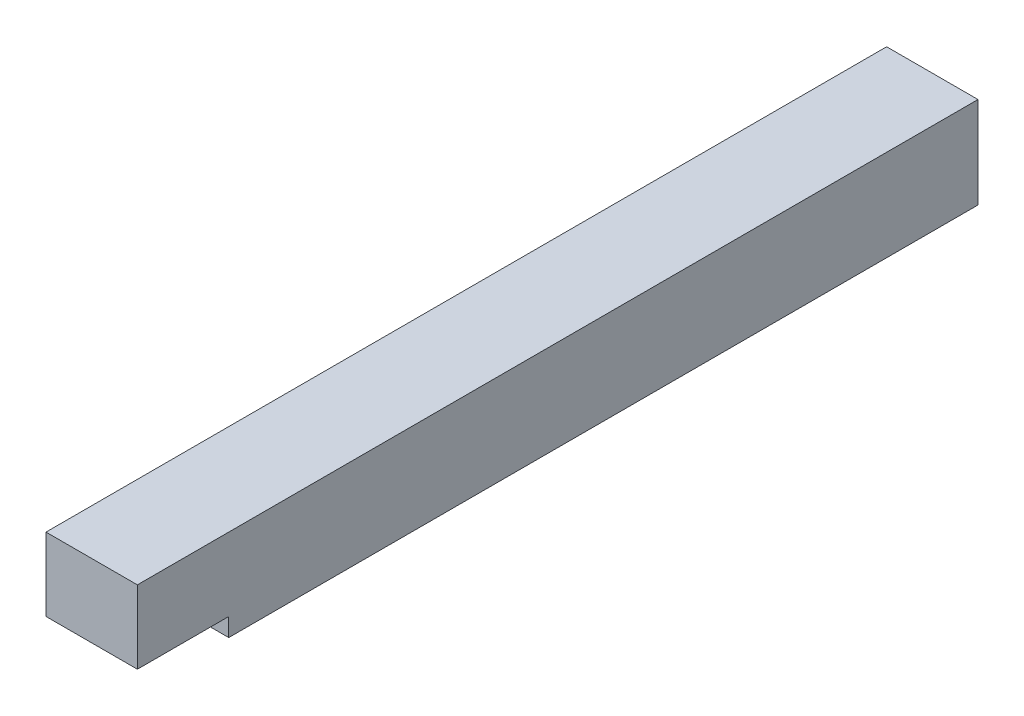
ISO-10303-21;
HEADER;
FILE_DESCRIPTION(('STEP AP214'),'2;1');
FILE_NAME('part.step','',(''),(''),'','','');
FILE_SCHEMA(('AUTOMOTIVE_DESIGN { 1 0 10303 214 1 1 1 1 }'));
ENDSEC;
DATA;
#1=APPLICATION_CONTEXT('core data for automotive mechanical design processes');
#2=APPLICATION_PROTOCOL_DEFINITION('international standard','automotive_design',2000,#1);
#3=PRODUCT_CONTEXT('',#1,'mechanical');
#4=PRODUCT('Part','Part','',(#3));
#5=PRODUCT_RELATED_PRODUCT_CATEGORY('part','',(#4));
#6=PRODUCT_DEFINITION_FORMATION('','',#4);
#7=PRODUCT_DEFINITION_CONTEXT('part definition',#1,'design');
#8=PRODUCT_DEFINITION('design','',#6,#7);
#9=PRODUCT_DEFINITION_SHAPE('','',#8);
#10=(LENGTH_UNIT() NAMED_UNIT(*) SI_UNIT(.MILLI.,.METRE.));
#11=(NAMED_UNIT(*) PLANE_ANGLE_UNIT() SI_UNIT($,.RADIAN.));
#12=(NAMED_UNIT(*) SI_UNIT($,.STERADIAN.) SOLID_ANGLE_UNIT());
#13=UNCERTAINTY_MEASURE_WITH_UNIT(LENGTH_MEASURE(1.E-05),#10,'distance_accuracy_value','');
#14=(GEOMETRIC_REPRESENTATION_CONTEXT(3) GLOBAL_UNCERTAINTY_ASSIGNED_CONTEXT((#13)) GLOBAL_UNIT_ASSIGNED_CONTEXT((#10,
#11,#12)) REPRESENTATION_CONTEXT('',''));
#15=CARTESIAN_POINT('',(0.,0.,0.));
#16=DIRECTION('',(0.,0.,1.));
#17=DIRECTION('',(1.,0.,0.));
#18=AXIS2_PLACEMENT_3D('',#15,#16,#17);
#19=CARTESIAN_POINT('',(0.,0.,92.));
#20=DIRECTION('',(1.,0.,0.));
#21=DIRECTION('',(0.,0.,-1.));
#22=AXIS2_PLACEMENT_3D('',#19,#20,#21);
#23=PLANE('',#22);
#24=DIRECTION('',(0.,0.,-1.));
#25=VECTOR('',#24,1.);
#26=CARTESIAN_POINT('',(0.,0.,92.));
#27=LINE('',#26,#25);
#28=CARTESIAN_POINT('',(0.,0.,82.));
#29=VERTEX_POINT('',#28);
#30=CARTESIAN_POINT('',(0.,0.,0.));
#31=VERTEX_POINT('',#30);
#32=EDGE_CURVE('E11',#29,#31,#27,.T.);
#33=ORIENTED_EDGE('',*,*,#32,.F.);
#34=DIRECTION('',(0.,-1.,0.));
#35=VECTOR('',#34,1.);
#36=CARTESIAN_POINT('',(0.,2.,82.));
#37=LINE('',#36,#35);
#38=CARTESIAN_POINT('',(0.,2.,82.));
#39=VERTEX_POINT('',#38);
#40=EDGE_CURVE('E101',#39,#29,#37,.T.);
#41=ORIENTED_EDGE('',*,*,#40,.F.);
#42=DIRECTION('',(0.,0.,-1.));
#43=VECTOR('',#42,1.);
#44=CARTESIAN_POINT('',(0.,2.,92.));
#45=LINE('',#44,#43);
#46=CARTESIAN_POINT('',(0.,2.,92.));
#47=VERTEX_POINT('',#46);
#48=EDGE_CURVE('E131',#47,#39,#45,.T.);
#49=ORIENTED_EDGE('',*,*,#48,.F.);
#50=DIRECTION('',(0.,-1.,0.));
#51=VECTOR('',#50,1.);
#52=CARTESIAN_POINT('',(0.,0.,92.));
#53=LINE('',#52,#51);
#54=CARTESIAN_POINT('',(0.,10.,92.));
#55=VERTEX_POINT('',#54);
#56=EDGE_CURVE('E84',#55,#47,#53,.T.);
#57=ORIENTED_EDGE('',*,*,#56,.F.);
#58=DIRECTION('',(0.,0.,-1.));
#59=VECTOR('',#58,1.);
#60=CARTESIAN_POINT('',(0.,10.,92.));
#61=LINE('',#60,#59);
#62=CARTESIAN_POINT('',(0.,10.,0.));
#63=VERTEX_POINT('',#62);
#64=EDGE_CURVE('E77',#55,#63,#61,.T.);
#65=ORIENTED_EDGE('',*,*,#64,.T.);
#66=DIRECTION('',(0.,-1.,0.));
#67=VECTOR('',#66,1.);
#68=CARTESIAN_POINT('',(0.,0.,0.));
#69=LINE('',#68,#67);
#70=EDGE_CURVE('E90',#63,#31,#69,.T.);
#71=ORIENTED_EDGE('',*,*,#70,.T.);
#72=EDGE_LOOP('',(#33,#41,#49,#57,#65,#71));
#73=FACE_BOUND('',#72,.T.);
#74=ADVANCED_FACE('F33',(#73),#23,.F.);
#75=CARTESIAN_POINT('',(0.,0.,92.));
#76=DIRECTION('',(0.,1.,0.));
#77=DIRECTION('',(0.,0.,1.));
#78=AXIS2_PLACEMENT_3D('',#75,#76,#77);
#79=PLANE('',#78);
#80=DIRECTION('',(0.,0.,-1.));
#81=VECTOR('',#80,1.);
#82=CARTESIAN_POINT('',(10.,0.,92.));
#83=LINE('',#82,#81);
#84=CARTESIAN_POINT('',(10.,0.,82.));
#85=VERTEX_POINT('',#84);
#86=CARTESIAN_POINT('',(10.,0.,0.));
#87=VERTEX_POINT('',#86);
#88=EDGE_CURVE('E40',#85,#87,#83,.T.);
#89=ORIENTED_EDGE('',*,*,#88,.F.);
#90=DIRECTION('',(1.,0.,0.));
#91=VECTOR('',#90,1.);
#92=CARTESIAN_POINT('',(10.,0.,82.));
#93=LINE('',#92,#91);
#94=EDGE_CURVE('E117',#29,#85,#93,.T.);
#95=ORIENTED_EDGE('',*,*,#94,.F.);
#96=ORIENTED_EDGE('',*,*,#32,.T.);
#97=DIRECTION('',(1.,0.,0.));
#98=VECTOR('',#97,1.);
#99=CARTESIAN_POINT('',(0.,0.,0.));
#100=LINE('',#99,#98);
#101=EDGE_CURVE('E96',#31,#87,#100,.T.);
#102=ORIENTED_EDGE('',*,*,#101,.T.);
#103=EDGE_LOOP('',(#89,#95,#96,#102));
#104=FACE_BOUND('',#103,.T.);
#105=ADVANCED_FACE('F114',(#104),#79,.F.);
#106=CARTESIAN_POINT('',(10.,0.,92.));
#107=DIRECTION('',(-1.,0.,0.));
#108=DIRECTION('',(0.,0.,1.));
#109=AXIS2_PLACEMENT_3D('',#106,#107,#108);
#110=PLANE('',#109);
#111=DIRECTION('',(0.,0.,1.));
#112=VECTOR('',#111,1.);
#113=CARTESIAN_POINT('',(10.,2.,92.));
#114=LINE('',#113,#112);
#115=CARTESIAN_POINT('',(10.,2.,82.));
#116=VERTEX_POINT('',#115);
#117=CARTESIAN_POINT('',(10.,2.,92.));
#118=VERTEX_POINT('',#117);
#119=EDGE_CURVE('E47',#116,#118,#114,.T.);
#120=ORIENTED_EDGE('',*,*,#119,.F.);
#121=DIRECTION('',(0.,-1.,0.));
#122=VECTOR('',#121,1.);
#123=CARTESIAN_POINT('',(10.,2.,82.));
#124=LINE('',#123,#122);
#125=EDGE_CURVE('E97',#116,#85,#124,.T.);
#126=ORIENTED_EDGE('',*,*,#125,.T.);
#127=ORIENTED_EDGE('',*,*,#88,.T.);
#128=DIRECTION('',(0.,1.,0.));
#129=VECTOR('',#128,1.);
#130=CARTESIAN_POINT('',(10.,0.,0.));
#131=LINE('',#130,#129);
#132=CARTESIAN_POINT('',(10.,10.,0.));
#133=VERTEX_POINT('',#132);
#134=EDGE_CURVE('E85',#87,#133,#131,.T.);
#135=ORIENTED_EDGE('',*,*,#134,.T.);
#136=DIRECTION('',(0.,0.,-1.));
#137=VECTOR('',#136,1.);
#138=CARTESIAN_POINT('',(10.,10.,92.));
#139=LINE('',#138,#137);
#140=CARTESIAN_POINT('',(10.,10.,92.));
#141=VERTEX_POINT('',#140);
#142=EDGE_CURVE('E80',#141,#133,#139,.T.);
#143=ORIENTED_EDGE('',*,*,#142,.F.);
#144=DIRECTION('',(0.,1.,0.));
#145=VECTOR('',#144,1.);
#146=CARTESIAN_POINT('',(10.,0.,92.));
#147=LINE('',#146,#145);
#148=EDGE_CURVE('E137',#118,#141,#147,.T.);
#149=ORIENTED_EDGE('',*,*,#148,.F.);
#150=EDGE_LOOP('',(#120,#126,#127,#135,#143,#149));
#151=FACE_BOUND('',#150,.T.);
#152=ADVANCED_FACE('F109',(#151),#110,.F.);
#153=CARTESIAN_POINT('',(0.,10.,92.));
#154=DIRECTION('',(0.,-1.,0.));
#155=DIRECTION('',(0.,0.,-1.));
#156=AXIS2_PLACEMENT_3D('',#153,#154,#155);
#157=PLANE('',#156);
#158=DIRECTION('',(-1.,0.,0.));
#159=VECTOR('',#158,1.);
#160=CARTESIAN_POINT('',(0.,10.,0.));
#161=LINE('',#160,#159);
#162=EDGE_CURVE('E74',#133,#63,#161,.T.);
#163=ORIENTED_EDGE('',*,*,#162,.T.);
#164=ORIENTED_EDGE('',*,*,#64,.F.);
#165=DIRECTION('',(-1.,0.,0.));
#166=VECTOR('',#165,1.);
#167=CARTESIAN_POINT('',(0.,10.,92.));
#168=LINE('',#167,#166);
#169=EDGE_CURVE('E56',#141,#55,#168,.T.);
#170=ORIENTED_EDGE('',*,*,#169,.F.);
#171=ORIENTED_EDGE('',*,*,#142,.T.);
#172=EDGE_LOOP('',(#163,#164,#170,#171));
#173=FACE_BOUND('',#172,.T.);
#174=ADVANCED_FACE('F76',(#173),#157,.F.);
#175=CARTESIAN_POINT('',(0.,0.,92.));
#176=DIRECTION('',(0.,0.,-1.));
#177=DIRECTION('',(-1.,0.,0.));
#178=AXIS2_PLACEMENT_3D('',#175,#176,#177);
#179=PLANE('',#178);
#180=ORIENTED_EDGE('',*,*,#56,.T.);
#181=DIRECTION('',(-1.,0.,0.));
#182=VECTOR('',#181,1.);
#183=CARTESIAN_POINT('',(10.,2.,92.));
#184=LINE('',#183,#182);
#185=EDGE_CURVE('E129',#118,#47,#184,.T.);
#186=ORIENTED_EDGE('',*,*,#185,.F.);
#187=ORIENTED_EDGE('',*,*,#148,.T.);
#188=ORIENTED_EDGE('',*,*,#169,.T.);
#189=EDGE_LOOP('',(#180,#186,#187,#188));
#190=FACE_BOUND('',#189,.T.);
#191=ADVANCED_FACE('F136',(#190),#179,.F.);
#192=CARTESIAN_POINT('',(0.,0.,0.));
#193=DIRECTION('',(0.,0.,-1.));
#194=DIRECTION('',(-1.,0.,0.));
#195=AXIS2_PLACEMENT_3D('',#192,#193,#194);
#196=PLANE('',#195);
#197=ORIENTED_EDGE('',*,*,#70,.F.);
#198=ORIENTED_EDGE('',*,*,#162,.F.);
#199=ORIENTED_EDGE('',*,*,#134,.F.);
#200=ORIENTED_EDGE('',*,*,#101,.F.);
#201=EDGE_LOOP('',(#197,#198,#199,#200));
#202=FACE_BOUND('',#201,.T.);
#203=ADVANCED_FACE('F94',(#202),#196,.T.);
#204=CARTESIAN_POINT('',(10.,2.,82.));
#205=DIRECTION('',(0.,0.,-1.));
#206=DIRECTION('',(-1.,0.,0.));
#207=AXIS2_PLACEMENT_3D('',#204,#205,#206);
#208=PLANE('',#207);
#209=ORIENTED_EDGE('',*,*,#94,.T.);
#210=ORIENTED_EDGE('',*,*,#125,.F.);
#211=DIRECTION('',(1.,0.,0.));
#212=VECTOR('',#211,1.);
#213=CARTESIAN_POINT('',(10.,2.,82.));
#214=LINE('',#213,#212);
#215=EDGE_CURVE('E134',#39,#116,#214,.T.);
#216=ORIENTED_EDGE('',*,*,#215,.F.);
#217=ORIENTED_EDGE('',*,*,#40,.T.);
#218=EDGE_LOOP('',(#209,#210,#216,#217));
#219=FACE_BOUND('',#218,.T.);
#220=ADVANCED_FACE('F143',(#219),#208,.F.);
#221=CARTESIAN_POINT('',(0.,2.,0.));
#222=DIRECTION('',(0.,1.,0.));
#223=DIRECTION('',(0.,0.,1.));
#224=AXIS2_PLACEMENT_3D('',#221,#222,#223);
#225=PLANE('',#224);
#226=ORIENTED_EDGE('',*,*,#119,.T.);
#227=ORIENTED_EDGE('',*,*,#185,.T.);
#228=ORIENTED_EDGE('',*,*,#48,.T.);
#229=ORIENTED_EDGE('',*,*,#215,.T.);
#230=EDGE_LOOP('',(#226,#227,#228,#229));
#231=FACE_BOUND('',#230,.T.);
#232=ADVANCED_FACE('F130',(#231),#225,.F.);
#233=CLOSED_SHELL('',(#74,#105,#152,#174,#191,#203,#220,#232));
#234=MANIFOLD_SOLID_BREP('B2',#233);
#235=ADVANCED_BREP_SHAPE_REPRESENTATION('',(#18,#234),#14);
#236=SHAPE_DEFINITION_REPRESENTATION(#9,#235);
ENDSEC;
END-ISO-10303-21;
